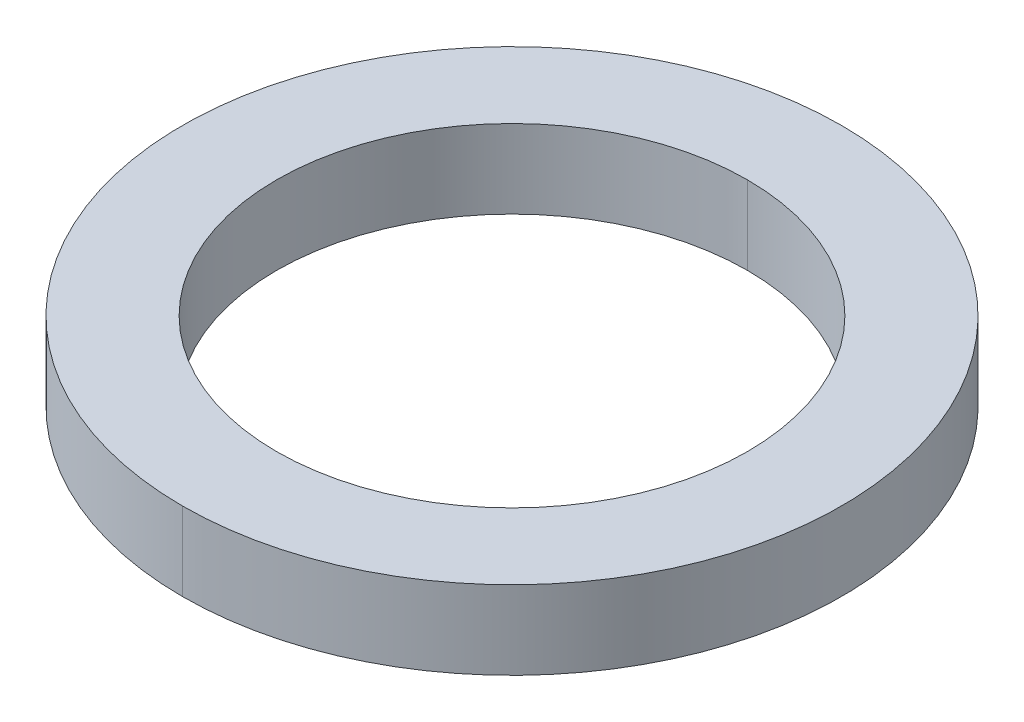
ISO-10303-21;
HEADER;
FILE_DESCRIPTION(('STEP AP214'),'2;1');
FILE_NAME('part.step','',(''),(''),'','','');
FILE_SCHEMA(('AUTOMOTIVE_DESIGN { 1 0 10303 214 1 1 1 1 }'));
ENDSEC;
DATA;
#1=APPLICATION_CONTEXT('core data for automotive mechanical design processes');
#2=APPLICATION_PROTOCOL_DEFINITION('international standard','automotive_design',2000,#1);
#3=PRODUCT_CONTEXT('',#1,'mechanical');
#4=PRODUCT('Part','Part','',(#3));
#5=PRODUCT_RELATED_PRODUCT_CATEGORY('part','',(#4));
#6=PRODUCT_DEFINITION_FORMATION('','',#4);
#7=PRODUCT_DEFINITION_CONTEXT('part definition',#1,'design');
#8=PRODUCT_DEFINITION('design','',#6,#7);
#9=PRODUCT_DEFINITION_SHAPE('','',#8);
#10=(LENGTH_UNIT() NAMED_UNIT(*) SI_UNIT(.MILLI.,.METRE.));
#11=(NAMED_UNIT(*) PLANE_ANGLE_UNIT() SI_UNIT($,.RADIAN.));
#12=(NAMED_UNIT(*) SI_UNIT($,.STERADIAN.) SOLID_ANGLE_UNIT());
#13=UNCERTAINTY_MEASURE_WITH_UNIT(LENGTH_MEASURE(1.E-05),#10,'distance_accuracy_value','');
#14=(GEOMETRIC_REPRESENTATION_CONTEXT(3) GLOBAL_UNCERTAINTY_ASSIGNED_CONTEXT((#13)) GLOBAL_UNIT_ASSIGNED_CONTEXT((#10,
#11,#12)) REPRESENTATION_CONTEXT('',''));
#15=CARTESIAN_POINT('',(0.,0.,0.));
#16=DIRECTION('',(0.,0.,1.));
#17=DIRECTION('',(1.,0.,0.));
#18=AXIS2_PLACEMENT_3D('',#15,#16,#17);
#19=CARTESIAN_POINT('',(0.,1.,0.));
#20=DIRECTION('',(0.,-1.,0.));
#21=DIRECTION('',(0.,0.,-1.));
#22=AXIS2_PLACEMENT_3D('',#19,#20,#21);
#23=CYLINDRICAL_SURFACE('',#22,3.);
#24=DIRECTION('',(0.,-1.,0.));
#25=VECTOR('',#24,1.);
#26=CARTESIAN_POINT('',(0.,1.,3.));
#27=LINE('',#26,#25);
#28=CARTESIAN_POINT('',(0.,1.,3.));
#29=VERTEX_POINT('',#28);
#30=CARTESIAN_POINT('',(0.,0.,3.));
#31=VERTEX_POINT('',#30);
#32=EDGE_CURVE('E71',#29,#31,#27,.T.);
#33=ORIENTED_EDGE('',*,*,#32,.F.);
#34=CARTESIAN_POINT('',(0.,1.,0.));
#35=DIRECTION('',(0.,1.,0.));
#36=DIRECTION('',(0.,0.,1.));
#37=AXIS2_PLACEMENT_3D('',#34,#35,#36);
#38=CIRCLE('',#37,3.);
#39=CARTESIAN_POINT('',(0.,1.,-3.));
#40=VERTEX_POINT('',#39);
#41=EDGE_CURVE('E66',#29,#40,#38,.T.);
#42=ORIENTED_EDGE('',*,*,#41,.T.);
#43=DIRECTION('',(0.,-1.,0.));
#44=VECTOR('',#43,1.);
#45=CARTESIAN_POINT('',(0.,1.,-3.));
#46=LINE('',#45,#44);
#47=CARTESIAN_POINT('',(0.,0.,-3.));
#48=VERTEX_POINT('',#47);
#49=EDGE_CURVE('E68',#40,#48,#46,.T.);
#50=ORIENTED_EDGE('',*,*,#49,.T.);
#51=CARTESIAN_POINT('',(0.,0.,0.));
#52=DIRECTION('',(0.,1.,0.));
#53=DIRECTION('',(0.,0.,1.));
#54=AXIS2_PLACEMENT_3D('',#51,#52,#53);
#55=CIRCLE('',#54,3.);
#56=EDGE_CURVE('E11',#31,#48,#55,.T.);
#57=ORIENTED_EDGE('',*,*,#56,.F.);
#58=EDGE_LOOP('',(#33,#42,#50,#57));
#59=FACE_BOUND('',#58,.T.);
#60=ADVANCED_FACE('F17',(#59),#23,.F.);
#61=CARTESIAN_POINT('',(0.,1.,0.));
#62=DIRECTION('',(0.,-1.,0.));
#63=DIRECTION('',(0.,0.,-1.));
#64=AXIS2_PLACEMENT_3D('',#61,#62,#63);
#65=CYLINDRICAL_SURFACE('',#64,4.2);
#66=DIRECTION('',(0.,-1.,0.));
#67=VECTOR('',#66,1.);
#68=CARTESIAN_POINT('',(0.,1.,4.2));
#69=LINE('',#68,#67);
#70=CARTESIAN_POINT('',(0.,1.,4.2));
#71=VERTEX_POINT('',#70);
#72=CARTESIAN_POINT('',(0.,0.,4.2));
#73=VERTEX_POINT('',#72);
#74=EDGE_CURVE('E106',#71,#73,#69,.T.);
#75=ORIENTED_EDGE('',*,*,#74,.F.);
#76=CARTESIAN_POINT('',(0.,1.,0.));
#77=DIRECTION('',(0.,1.,0.));
#78=DIRECTION('',(0.,0.,1.));
#79=AXIS2_PLACEMENT_3D('',#76,#77,#78);
#80=CIRCLE('',#79,4.2);
#81=CARTESIAN_POINT('',(0.,1.,-4.2));
#82=VERTEX_POINT('',#81);
#83=EDGE_CURVE('E76',#82,#71,#80,.T.);
#84=ORIENTED_EDGE('',*,*,#83,.F.);
#85=DIRECTION('',(0.,-1.,0.));
#86=VECTOR('',#85,1.);
#87=CARTESIAN_POINT('',(0.,1.,-4.2));
#88=LINE('',#87,#86);
#89=CARTESIAN_POINT('',(0.,0.,-4.2));
#90=VERTEX_POINT('',#89);
#91=EDGE_CURVE('E99',#82,#90,#88,.T.);
#92=ORIENTED_EDGE('',*,*,#91,.T.);
#93=CARTESIAN_POINT('',(0.,0.,0.));
#94=DIRECTION('',(0.,1.,0.));
#95=DIRECTION('',(0.,0.,1.));
#96=AXIS2_PLACEMENT_3D('',#93,#94,#95);
#97=CIRCLE('',#96,4.2);
#98=EDGE_CURVE('E26',#90,#73,#97,.T.);
#99=ORIENTED_EDGE('',*,*,#98,.T.);
#100=EDGE_LOOP('',(#75,#84,#92,#99));
#101=FACE_BOUND('',#100,.T.);
#102=ADVANCED_FACE('F122',(#101),#65,.T.);
#103=CARTESIAN_POINT('',(0.,0.,0.));
#104=DIRECTION('',(0.,1.,0.));
#105=DIRECTION('',(1.,0.,0.));
#106=AXIS2_PLACEMENT_3D('',#103,#104,#105);
#107=PLANE('',#106);
#108=CARTESIAN_POINT('',(0.,0.,0.));
#109=DIRECTION('',(0.,1.,0.));
#110=DIRECTION('',(0.,0.,1.));
#111=AXIS2_PLACEMENT_3D('',#108,#109,#110);
#112=CIRCLE('',#111,3.);
#113=EDGE_CURVE('E82',#48,#31,#112,.T.);
#114=ORIENTED_EDGE('',*,*,#113,.T.);
#115=ORIENTED_EDGE('',*,*,#56,.T.);
#116=EDGE_LOOP('',(#114,#115));
#117=FACE_BOUND('',#116,.T.);
#118=ORIENTED_EDGE('',*,*,#98,.F.);
#119=CARTESIAN_POINT('',(0.,0.,0.));
#120=DIRECTION('',(0.,1.,0.));
#121=DIRECTION('',(0.,0.,1.));
#122=AXIS2_PLACEMENT_3D('',#119,#120,#121);
#123=CIRCLE('',#122,4.2);
#124=EDGE_CURVE('E101',#73,#90,#123,.T.);
#125=ORIENTED_EDGE('',*,*,#124,.F.);
#126=EDGE_LOOP('',(#118,#125));
#127=FACE_BOUND('',#126,.T.);
#128=ADVANCED_FACE('F120',(#117,#127),#107,.F.);
#129=CARTESIAN_POINT('',(0.,1.,0.));
#130=DIRECTION('',(0.,1.,0.));
#131=DIRECTION('',(1.,0.,0.));
#132=AXIS2_PLACEMENT_3D('',#129,#130,#131);
#133=PLANE('',#132);
#134=CARTESIAN_POINT('',(0.,1.,0.));
#135=DIRECTION('',(0.,1.,0.));
#136=DIRECTION('',(0.,0.,1.));
#137=AXIS2_PLACEMENT_3D('',#134,#135,#136);
#138=CIRCLE('',#137,3.);
#139=EDGE_CURVE('E80',#40,#29,#138,.T.);
#140=ORIENTED_EDGE('',*,*,#139,.F.);
#141=ORIENTED_EDGE('',*,*,#41,.F.);
#142=EDGE_LOOP('',(#140,#141));
#143=FACE_BOUND('',#142,.T.);
#144=ORIENTED_EDGE('',*,*,#83,.T.);
#145=CARTESIAN_POINT('',(0.,1.,0.));
#146=DIRECTION('',(0.,1.,0.));
#147=DIRECTION('',(0.,0.,1.));
#148=AXIS2_PLACEMENT_3D('',#145,#146,#147);
#149=CIRCLE('',#148,4.2);
#150=EDGE_CURVE('E84',#71,#82,#149,.T.);
#151=ORIENTED_EDGE('',*,*,#150,.T.);
#152=EDGE_LOOP('',(#144,#151));
#153=FACE_BOUND('',#152,.T.);
#154=ADVANCED_FACE('F86',(#143,#153),#133,.T.);
#155=CARTESIAN_POINT('',(0.,1.,0.));
#156=DIRECTION('',(0.,-1.,0.));
#157=DIRECTION('',(0.,0.,-1.));
#158=AXIS2_PLACEMENT_3D('',#155,#156,#157);
#159=CYLINDRICAL_SURFACE('',#158,4.2);
#160=ORIENTED_EDGE('',*,*,#150,.F.);
#161=ORIENTED_EDGE('',*,*,#74,.T.);
#162=ORIENTED_EDGE('',*,*,#124,.T.);
#163=ORIENTED_EDGE('',*,*,#91,.F.);
#164=EDGE_LOOP('',(#160,#161,#162,#163));
#165=FACE_BOUND('',#164,.T.);
#166=ADVANCED_FACE('F118',(#165),#159,.T.);
#167=CARTESIAN_POINT('',(0.,1.,0.));
#168=DIRECTION('',(0.,-1.,0.));
#169=DIRECTION('',(0.,0.,-1.));
#170=AXIS2_PLACEMENT_3D('',#167,#168,#169);
#171=CYLINDRICAL_SURFACE('',#170,3.);
#172=ORIENTED_EDGE('',*,*,#139,.T.);
#173=ORIENTED_EDGE('',*,*,#32,.T.);
#174=ORIENTED_EDGE('',*,*,#113,.F.);
#175=ORIENTED_EDGE('',*,*,#49,.F.);
#176=EDGE_LOOP('',(#172,#173,#174,#175));
#177=FACE_BOUND('',#176,.T.);
#178=ADVANCED_FACE('F79',(#177),#171,.F.);
#179=CLOSED_SHELL('',(#60,#102,#128,#154,#166,#178));
#180=MANIFOLD_SOLID_BREP('B1',#179);
#181=ADVANCED_BREP_SHAPE_REPRESENTATION('',(#18,#180),#14);
#182=SHAPE_DEFINITION_REPRESENTATION(#9,#181);
ENDSEC;
END-ISO-10303-21;
